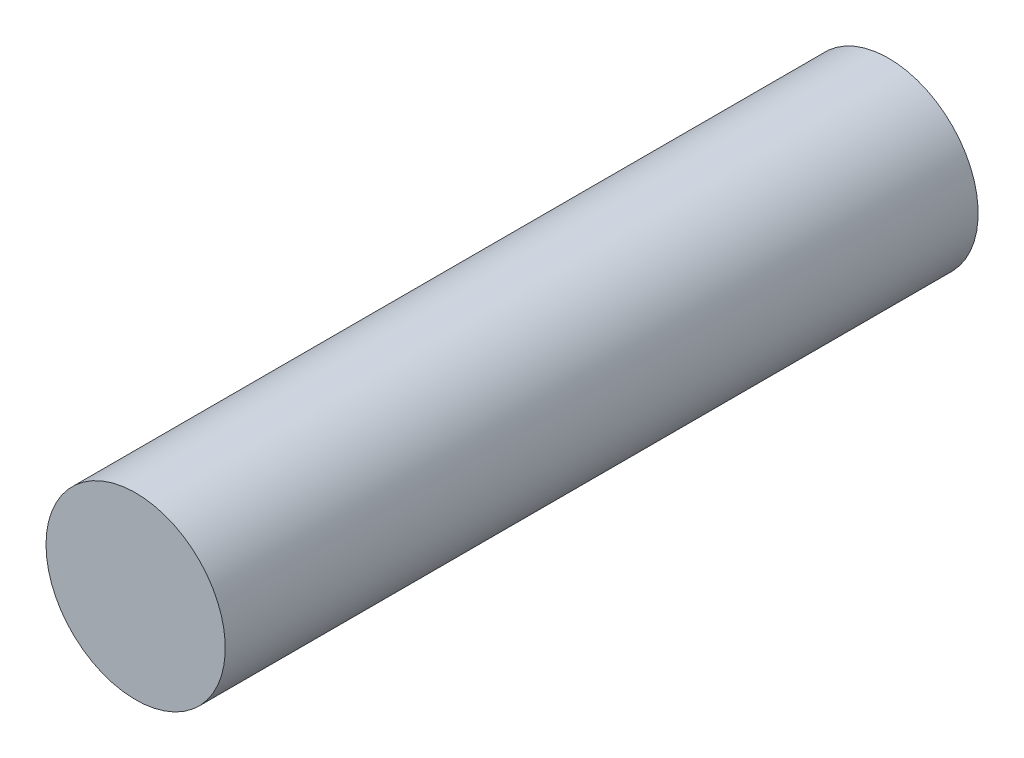
ISO-10303-21;
HEADER;
FILE_DESCRIPTION(('STEP AP214'),'2;1');
FILE_NAME('part.step','',(''),(''),'','','');
FILE_SCHEMA(('AUTOMOTIVE_DESIGN { 1 0 10303 214 1 1 1 1 }'));
ENDSEC;
DATA;
#1=APPLICATION_CONTEXT('core data for automotive mechanical design processes');
#2=APPLICATION_PROTOCOL_DEFINITION('international standard','automotive_design',2000,#1);
#3=PRODUCT_CONTEXT('',#1,'mechanical');
#4=PRODUCT('Part','Part','',(#3));
#5=PRODUCT_RELATED_PRODUCT_CATEGORY('part','',(#4));
#6=PRODUCT_DEFINITION_FORMATION('','',#4);
#7=PRODUCT_DEFINITION_CONTEXT('part definition',#1,'design');
#8=PRODUCT_DEFINITION('design','',#6,#7);
#9=PRODUCT_DEFINITION_SHAPE('','',#8);
#10=(LENGTH_UNIT() NAMED_UNIT(*) SI_UNIT(.MILLI.,.METRE.));
#11=(NAMED_UNIT(*) PLANE_ANGLE_UNIT() SI_UNIT($,.RADIAN.));
#12=(NAMED_UNIT(*) SI_UNIT($,.STERADIAN.) SOLID_ANGLE_UNIT());
#13=UNCERTAINTY_MEASURE_WITH_UNIT(LENGTH_MEASURE(1.E-05),#10,'distance_accuracy_value','');
#14=(GEOMETRIC_REPRESENTATION_CONTEXT(3) GLOBAL_UNCERTAINTY_ASSIGNED_CONTEXT((#13)) GLOBAL_UNIT_ASSIGNED_CONTEXT((#10,
#11,#12)) REPRESENTATION_CONTEXT('',''));
#15=CARTESIAN_POINT('',(0.,0.,0.));
#16=DIRECTION('',(0.,0.,1.));
#17=DIRECTION('',(1.,0.,0.));
#18=AXIS2_PLACEMENT_3D('',#15,#16,#17);
#19=CARTESIAN_POINT('',(0.,0.,21.));
#20=DIRECTION('',(0.,0.,-1.));
#21=DIRECTION('',(-1.,0.,0.));
#22=AXIS2_PLACEMENT_3D('',#19,#20,#21);
#23=CYLINDRICAL_SURFACE('',#22,2.5);
#24=CARTESIAN_POINT('',(0.,0.,21.));
#25=DIRECTION('',(0.,0.,1.));
#26=DIRECTION('',(1.,0.,0.));
#27=AXIS2_PLACEMENT_3D('',#24,#25,#26);
#28=CIRCLE('',#27,2.5);
#29=CARTESIAN_POINT('',(-2.5,0.,21.));
#30=VERTEX_POINT('',#29);
#31=EDGE_CURVE('E10',#30,#30,#28,.T.);
#32=CARTESIAN_POINT('',(0.,0.,0.));
#33=DIRECTION('',(0.,0.,1.));
#34=DIRECTION('',(1.,0.,0.));
#35=AXIS2_PLACEMENT_3D('',#32,#33,#34);
#36=CIRCLE('',#35,2.5);
#37=CARTESIAN_POINT('',(-2.5,0.,0.));
#38=VERTEX_POINT('',#37);
#39=EDGE_CURVE('E44',#38,#38,#36,.T.);
#40=CARTESIAN_POINT('',(-2.5,0.,21.));
#41=CARTESIAN_POINT('',(-2.5,0.,20.78125));
#42=CARTESIAN_POINT('',(-2.5,0.,20.5625));
#43=CARTESIAN_POINT('',(-2.5,0.,20.125));
#44=CARTESIAN_POINT('',(-2.5,0.,19.90625));
#45=CARTESIAN_POINT('',(-2.5,0.,19.46875));
#46=CARTESIAN_POINT('',(-2.5,0.,19.25));
#47=CARTESIAN_POINT('',(-2.5,0.,18.8125));
#48=CARTESIAN_POINT('',(-2.5,0.,18.59375));
#49=CARTESIAN_POINT('',(-2.5,0.,18.15625));
#50=CARTESIAN_POINT('',(-2.5,0.,17.9375));
#51=CARTESIAN_POINT('',(-2.5,0.,17.5));
#52=CARTESIAN_POINT('',(-2.5,0.,17.28125));
#53=CARTESIAN_POINT('',(-2.5,0.,16.84375));
#54=CARTESIAN_POINT('',(-2.5,0.,16.625));
#55=CARTESIAN_POINT('',(-2.5,0.,16.1875));
#56=CARTESIAN_POINT('',(-2.5,0.,15.96875));
#57=CARTESIAN_POINT('',(-2.5,0.,15.53125));
#58=CARTESIAN_POINT('',(-2.5,0.,15.3125));
#59=CARTESIAN_POINT('',(-2.5,0.,14.875));
#60=CARTESIAN_POINT('',(-2.5,0.,14.65625));
#61=CARTESIAN_POINT('',(-2.5,0.,14.21875));
#62=CARTESIAN_POINT('',(-2.5,0.,14.));
#63=CARTESIAN_POINT('',(-2.5,0.,13.5625));
#64=CARTESIAN_POINT('',(-2.5,0.,13.34375));
#65=CARTESIAN_POINT('',(-2.5,0.,12.90625));
#66=CARTESIAN_POINT('',(-2.5,0.,12.6875));
#67=CARTESIAN_POINT('',(-2.5,0.,12.25));
#68=CARTESIAN_POINT('',(-2.5,0.,12.03125));
#69=CARTESIAN_POINT('',(-2.5,0.,11.59375));
#70=CARTESIAN_POINT('',(-2.5,0.,11.375));
#71=CARTESIAN_POINT('',(-2.5,0.,10.9375));
#72=CARTESIAN_POINT('',(-2.5,0.,10.71875));
#73=CARTESIAN_POINT('',(-2.5,0.,10.28125));
#74=CARTESIAN_POINT('',(-2.5,0.,10.0625));
#75=CARTESIAN_POINT('',(-2.5,0.,9.625));
#76=CARTESIAN_POINT('',(-2.5,0.,9.40625));
#77=CARTESIAN_POINT('',(-2.5,0.,8.96875));
#78=CARTESIAN_POINT('',(-2.5,0.,8.75));
#79=CARTESIAN_POINT('',(-2.5,0.,8.3125));
#80=CARTESIAN_POINT('',(-2.5,0.,8.09375));
#81=CARTESIAN_POINT('',(-2.5,0.,7.65625));
#82=CARTESIAN_POINT('',(-2.5,0.,7.4375));
#83=CARTESIAN_POINT('',(-2.5,0.,7.));
#84=CARTESIAN_POINT('',(-2.5,0.,6.78125));
#85=CARTESIAN_POINT('',(-2.5,0.,6.34375));
#86=CARTESIAN_POINT('',(-2.5,0.,6.125));
#87=CARTESIAN_POINT('',(-2.5,0.,5.6875));
#88=CARTESIAN_POINT('',(-2.5,0.,5.46875));
#89=CARTESIAN_POINT('',(-2.5,0.,5.03125));
#90=CARTESIAN_POINT('',(-2.5,0.,4.8125));
#91=CARTESIAN_POINT('',(-2.5,0.,4.375));
#92=CARTESIAN_POINT('',(-2.5,0.,4.15625));
#93=CARTESIAN_POINT('',(-2.5,0.,3.71875));
#94=CARTESIAN_POINT('',(-2.5,0.,3.5));
#95=CARTESIAN_POINT('',(-2.5,0.,3.0625));
#96=CARTESIAN_POINT('',(-2.5,0.,2.84375));
#97=CARTESIAN_POINT('',(-2.5,0.,2.40625));
#98=CARTESIAN_POINT('',(-2.5,0.,2.1875));
#99=CARTESIAN_POINT('',(-2.5,0.,1.75));
#100=CARTESIAN_POINT('',(-2.5,0.,1.53125));
#101=CARTESIAN_POINT('',(-2.5,0.,1.09375));
#102=CARTESIAN_POINT('',(-2.5,0.,0.875000000000001));
#103=CARTESIAN_POINT('',(-2.5,0.,0.4375));
#104=CARTESIAN_POINT('',(-2.5,0.,0.21875));
#105=CARTESIAN_POINT('',(-2.5,0.,0.));
#106=B_SPLINE_CURVE_WITH_KNOTS('',3,(#40,#41,#42,#43,#44,#45,#46,#47,#48,#49,#50,#51,#52,#53,
#54,#55,#56,#57,#58,#59,#60,#61,#62,#63,#64,#65,#66,#67,#68,#69,#70,#71,#72,#73,#74,#75,#76,#77,
#78,#79,#80,#81,#82,#83,#84,#85,#86,#87,#88,#89,#90,#91,#92,#93,#94,#95,#96,#97,#98,#99,#100,
#101,#102,#103,#104,#105),.UNSPECIFIED.,.F.,.F.,(4,2,2,2,2,2,2,2,2,2,2,2,2,2,2,2,2,2,2,2,2,2,2,
2,2,2,2,2,2,2,2,2,4),(0.,0.656250000000001,1.3125,1.96875,2.625,3.28125,3.9375,4.59375,5.25,
5.90625,6.5625,7.21875,7.875,8.53125,9.1875,9.84375,10.5,11.15625,11.8125,12.46875,13.125,
13.78125,14.4375,15.09375,15.75,16.40625,17.0625,17.71875,18.375,19.03125,19.6875,20.34375,21.),.UNSPECIFIED.);
#107=EDGE_CURVE('BSEAM41',#30,#38,#106,.T.);
#108=ORIENTED_EDGE('',*,*,#31,.F.);
#109=ORIENTED_EDGE('',*,*,#39,.T.);
#110=ORIENTED_EDGE('',*,*,#107,.T.);
#111=ORIENTED_EDGE('',*,*,#107,.F.);
#112=EDGE_LOOP('',(#108,#110,#109,#111));
#113=FACE_BOUND('',#112,.T.);
#114=ADVANCED_FACE('F41',(#113),#23,.T.);
#115=CARTESIAN_POINT('',(0.,0.,21.));
#116=DIRECTION('',(0.,0.,1.));
#117=DIRECTION('',(1.,0.,0.));
#118=AXIS2_PLACEMENT_3D('',#115,#116,#117);
#119=PLANE('',#118);
#120=ORIENTED_EDGE('',*,*,#31,.T.);
#121=EDGE_LOOP('',(#120));
#122=FACE_BOUND('',#121,.T.);
#123=ADVANCED_FACE('F58',(#122),#119,.T.);
#124=CARTESIAN_POINT('',(0.,0.,0.));
#125=DIRECTION('',(0.,0.,1.));
#126=DIRECTION('',(1.,0.,0.));
#127=AXIS2_PLACEMENT_3D('',#124,#125,#126);
#128=PLANE('',#127);
#129=ORIENTED_EDGE('',*,*,#39,.F.);
#130=EDGE_LOOP('',(#129));
#131=FACE_BOUND('',#130,.T.);
#132=ADVANCED_FACE('F56',(#131),#128,.F.);
#133=CLOSED_SHELL('',(#114,#123,#132));
#134=MANIFOLD_SOLID_BREP('B2',#133);
#135=ADVANCED_BREP_SHAPE_REPRESENTATION('',(#18,#134),#14);
#136=SHAPE_DEFINITION_REPRESENTATION(#9,#135);
ENDSEC;
END-ISO-10303-21;
